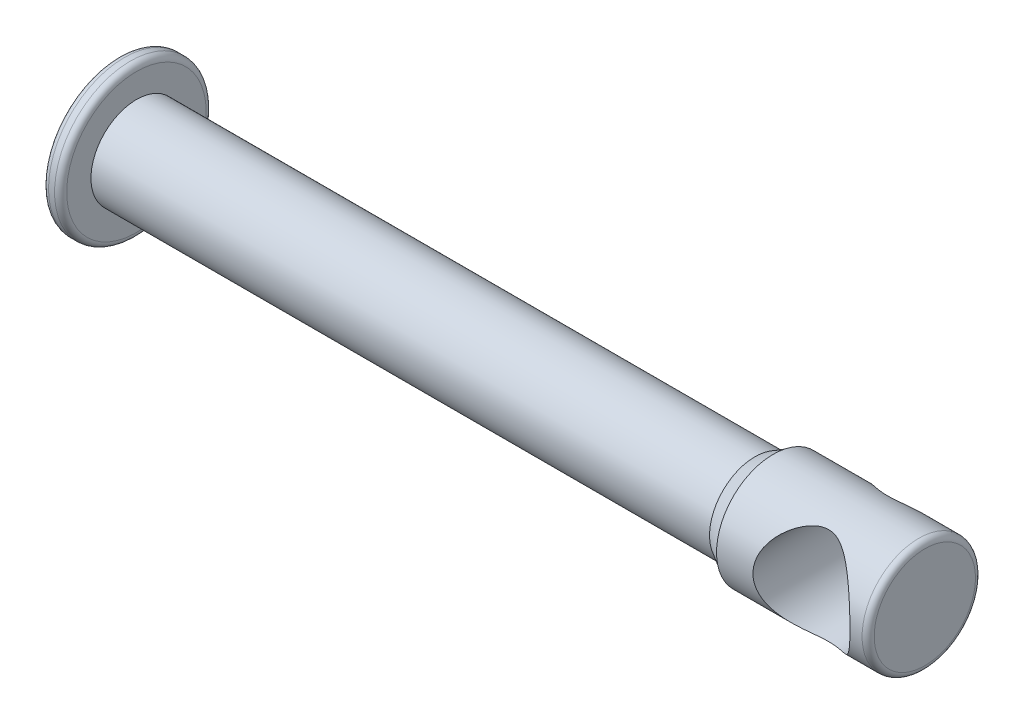
ISO-10303-21;
HEADER;
FILE_DESCRIPTION(('STEP AP214'),'2;1');
FILE_NAME('part.step','',(''),(''),'','','');
FILE_SCHEMA(('AUTOMOTIVE_DESIGN { 1 0 10303 214 1 1 1 1 }'));
ENDSEC;
DATA;
#1=APPLICATION_CONTEXT('core data for automotive mechanical design processes');
#2=APPLICATION_PROTOCOL_DEFINITION('international standard','automotive_design',2000,#1);
#3=PRODUCT_CONTEXT('',#1,'mechanical');
#4=PRODUCT('Part','Part','',(#3));
#5=PRODUCT_RELATED_PRODUCT_CATEGORY('part','',(#4));
#6=PRODUCT_DEFINITION_FORMATION('','',#4);
#7=PRODUCT_DEFINITION_CONTEXT('part definition',#1,'design');
#8=PRODUCT_DEFINITION('design','',#6,#7);
#9=PRODUCT_DEFINITION_SHAPE('','',#8);
#10=(LENGTH_UNIT() NAMED_UNIT(*) SI_UNIT(.MILLI.,.METRE.));
#11=(NAMED_UNIT(*) PLANE_ANGLE_UNIT() SI_UNIT($,.RADIAN.));
#12=(NAMED_UNIT(*) SI_UNIT($,.STERADIAN.) SOLID_ANGLE_UNIT());
#13=UNCERTAINTY_MEASURE_WITH_UNIT(LENGTH_MEASURE(1.E-05),#10,'distance_accuracy_value','');
#14=(GEOMETRIC_REPRESENTATION_CONTEXT(3) GLOBAL_UNCERTAINTY_ASSIGNED_CONTEXT((#13)) GLOBAL_UNIT_ASSIGNED_CONTEXT((#10,
#11,#12)) REPRESENTATION_CONTEXT('',''));
#15=CARTESIAN_POINT('',(0.,0.,0.));
#16=DIRECTION('',(0.,0.,1.));
#17=DIRECTION('',(1.,0.,0.));
#18=AXIS2_PLACEMENT_3D('',#15,#16,#17);
#19=CARTESIAN_POINT('',(0.,0.,0.));
#20=DIRECTION('',(-1.,0.,0.));
#21=DIRECTION('',(0.,0.,1.));
#22=AXIS2_PLACEMENT_3D('',#19,#20,#21);
#23=PLANE('',#22);
#24=CARTESIAN_POINT('',(0.,0.,0.));
#25=DIRECTION('',(-1.,0.,0.));
#26=DIRECTION('',(0.,0.,1.));
#27=AXIS2_PLACEMENT_3D('',#24,#25,#26);
#28=CIRCLE('',#27,11.5);
#29=CARTESIAN_POINT('',(0.,0.,11.5));
#30=VERTEX_POINT('',#29);
#31=EDGE_CURVE('E50',#30,#30,#28,.T.);
#32=ORIENTED_EDGE('',*,*,#31,.T.);
#33=EDGE_LOOP('',(#32));
#34=FACE_BOUND('',#33,.T.);
#35=ADVANCED_FACE('F37',(#34),#23,.T.);
#36=CARTESIAN_POINT('',(133.,0.,0.));
#37=DIRECTION('',(1.,0.,0.));
#38=DIRECTION('',(0.,0.,-1.));
#39=AXIS2_PLACEMENT_3D('',#36,#37,#38);
#40=CYLINDRICAL_SURFACE('',#39,12.5);
#41=CARTESIAN_POINT('',(2.,0.,0.));
#42=DIRECTION('',(1.,0.,0.));
#43=DIRECTION('',(0.,0.,-1.));
#44=AXIS2_PLACEMENT_3D('',#41,#42,#43);
#45=CIRCLE('',#44,12.5);
#46=CARTESIAN_POINT('',(2.,0.,-12.5));
#47=VERTEX_POINT('',#46);
#48=EDGE_CURVE('E55',#47,#47,#45,.F.);
#49=ORIENTED_EDGE('',*,*,#48,.T.);
#50=EDGE_LOOP('',(#49));
#51=FACE_BOUND('',#50,.T.);
#52=CARTESIAN_POINT('',(1.,0.,0.));
#53=DIRECTION('',(-1.,0.,0.));
#54=DIRECTION('',(0.,0.,1.));
#55=AXIS2_PLACEMENT_3D('',#52,#53,#54);
#56=CIRCLE('',#55,12.5);
#57=CARTESIAN_POINT('',(1.,0.,12.5));
#58=VERTEX_POINT('',#57);
#59=EDGE_CURVE('E61',#58,#58,#56,.F.);
#60=ORIENTED_EDGE('',*,*,#59,.T.);
#61=EDGE_LOOP('',(#60));
#62=FACE_BOUND('',#61,.T.);
#63=ADVANCED_FACE('F106',(#51,#62),#40,.T.);
#64=CARTESIAN_POINT('',(3.,0.,-12.5));
#65=DIRECTION('',(1.,0.,0.));
#66=DIRECTION('',(0.,0.,-1.));
#67=AXIS2_PLACEMENT_3D('',#64,#65,#66);
#68=PLANE('',#67);
#69=CARTESIAN_POINT('',(3.,0.,0.));
#70=DIRECTION('',(1.,0.,0.));
#71=DIRECTION('',(0.,0.,-1.));
#72=AXIS2_PLACEMENT_3D('',#69,#70,#71);
#73=CIRCLE('',#72,11.5);
#74=CARTESIAN_POINT('',(3.,0.,-11.5));
#75=VERTEX_POINT('',#74);
#76=EDGE_CURVE('E65',#75,#75,#73,.T.);
#77=ORIENTED_EDGE('',*,*,#76,.T.);
#78=EDGE_LOOP('',(#77));
#79=FACE_BOUND('',#78,.T.);
#80=CARTESIAN_POINT('',(3.,0.,0.));
#81=DIRECTION('',(1.,0.,0.));
#82=DIRECTION('',(0.,0.,-1.));
#83=AXIS2_PLACEMENT_3D('',#80,#81,#82);
#84=CIRCLE('',#83,7.49999999999998);
#85=CARTESIAN_POINT('',(3.,0.,-7.49999999999998));
#86=VERTEX_POINT('',#85);
#87=EDGE_CURVE('E210',#86,#86,#84,.T.);
#88=ORIENTED_EDGE('',*,*,#87,.F.);
#89=EDGE_LOOP('',(#88));
#90=FACE_BOUND('',#89,.T.);
#91=ADVANCED_FACE('F112',(#79,#90),#68,.T.);
#92=CARTESIAN_POINT('',(133.,0.,0.));
#93=DIRECTION('',(1.,0.,0.));
#94=DIRECTION('',(0.,0.,-1.));
#95=AXIS2_PLACEMENT_3D('',#92,#93,#94);
#96=CYLINDRICAL_SURFACE('',#95,7.49999999999998);
#97=CARTESIAN_POINT('',(105.,0.,0.));
#98=DIRECTION('',(-1.,0.,0.));
#99=DIRECTION('',(0.,0.,1.));
#100=AXIS2_PLACEMENT_3D('',#97,#98,#99);
#101=CIRCLE('',#100,7.49999999999998);
#102=CARTESIAN_POINT('',(105.,0.,-7.49999999999998));
#103=VERTEX_POINT('',#102);
#104=EDGE_CURVE('E69',#103,#103,#101,.T.);
#105=ORIENTED_EDGE('',*,*,#104,.T.);
#106=EDGE_LOOP('',(#105));
#107=FACE_BOUND('',#106,.T.);
#108=ORIENTED_EDGE('',*,*,#87,.T.);
#109=EDGE_LOOP('',(#108));
#110=FACE_BOUND('',#109,.T.);
#111=ADVANCED_FACE('F166',(#107,#110),#96,.T.);
#112=CARTESIAN_POINT('',(108.,0.,-7.49999999999998));
#113=DIRECTION('',(-1.,0.,0.));
#114=DIRECTION('',(0.,0.,1.));
#115=AXIS2_PLACEMENT_3D('',#112,#113,#114);
#116=PLANE('',#115);
#117=CARTESIAN_POINT('',(108.,0.,0.));
#118=DIRECTION('',(-1.,0.,0.));
#119=DIRECTION('',(0.,0.,1.));
#120=AXIS2_PLACEMENT_3D('',#117,#118,#119);
#121=CIRCLE('',#120,9.23205080756886);
#122=CARTESIAN_POINT('',(108.,0.,-9.23205080756886));
#123=VERTEX_POINT('',#122);
#124=EDGE_CURVE('E213',#123,#123,#121,.F.);
#125=ORIENTED_EDGE('',*,*,#124,.T.);
#126=EDGE_LOOP('',(#125));
#127=FACE_BOUND('',#126,.T.);
#128=CARTESIAN_POINT('',(108.,0.,0.));
#129=DIRECTION('',(1.,0.,0.));
#130=DIRECTION('',(0.,0.,-1.));
#131=AXIS2_PLACEMENT_3D('',#128,#129,#130);
#132=CIRCLE('',#131,9.35);
#133=CARTESIAN_POINT('',(108.,0.,-9.35));
#134=VERTEX_POINT('',#133);
#135=EDGE_CURVE('E79',#134,#134,#132,.T.);
#136=ORIENTED_EDGE('',*,*,#135,.F.);
#137=EDGE_LOOP('',(#136));
#138=FACE_BOUND('',#137,.T.);
#139=ADVANCED_FACE('F104',(#127,#138),#116,.T.);
#140=CARTESIAN_POINT('',(133.,0.,0.));
#141=DIRECTION('',(1.,0.,0.));
#142=DIRECTION('',(0.,0.,-1.));
#143=AXIS2_PLACEMENT_3D('',#140,#141,#142);
#144=CYLINDRICAL_SURFACE('',#143,9.35);
#145=CARTESIAN_POINT('',(132.,0.,0.));
#146=DIRECTION('',(1.,0.,0.));
#147=DIRECTION('',(0.,0.,-1.));
#148=AXIS2_PLACEMENT_3D('',#145,#146,#147);
#149=CIRCLE('',#148,9.35);
#150=CARTESIAN_POINT('',(132.,0.,-9.35));
#151=VERTEX_POINT('',#150);
#152=EDGE_CURVE('E10',#151,#151,#149,.F.);
#153=ORIENTED_EDGE('',*,*,#152,.T.);
#154=EDGE_LOOP('',(#153));
#155=FACE_BOUND('',#154,.T.);
#156=CARTESIAN_POINT('',(114.,0.,-9.35));
#157=CARTESIAN_POINT('',(113.999993918719,0.188513810223147,-9.3500059874259));
#158=CARTESIAN_POINT('',(114.00667046917,0.376974489429372,-9.34429094709547));
#159=CARTESIAN_POINT('',(114.033233959912,0.752339175981538,-9.32157765394355));
#160=CARTESIAN_POINT('',(114.05312367289,0.939242848263982,-9.30457703292499));
#161=CARTESIAN_POINT('',(114.105762021047,1.31000094157737,-9.25966015805698));
#162=CARTESIAN_POINT('',(114.138518632541,1.49385339730529,-9.23173713335002));
#163=CARTESIAN_POINT('',(114.216322164976,1.85711564710278,-9.16557262843749));
#164=CARTESIAN_POINT('',(114.26137438946,2.03652348754017,-9.12732669566652));
#165=CARTESIAN_POINT('',(114.362690090872,2.38847463003709,-9.04158612447));
#166=CARTESIAN_POINT('',(114.418875841079,2.56105609273721,-8.9941556557971));
#167=CARTESIAN_POINT('',(114.541877746082,2.89981081140834,-8.89072434564867));
#168=CARTESIAN_POINT('',(114.608698547206,3.06598122686232,-8.83471975865107));
#169=CARTESIAN_POINT('',(114.752123158968,3.39114343366845,-8.71508198169362));
#170=CARTESIAN_POINT('',(114.828725294421,3.55013644795042,-8.65145009812462));
#171=CARTESIAN_POINT('',(114.990936860748,3.86053279387089,-8.51747477777205));
#172=CARTESIAN_POINT('',(115.076548244839,4.01193446914854,-8.44712988590837));
#173=CARTESIAN_POINT('',(115.290034780286,4.36268261325394,-8.27290795245535));
#174=CARTESIAN_POINT('',(115.421638480642,4.55847596789633,-8.16641973997555));
#175=CARTESIAN_POINT('',(115.698885861276,4.93463241656784,-7.9447842256729));
#176=CARTESIAN_POINT('',(115.84453446207,5.11499006074713,-7.82963389227694));
#177=CARTESIAN_POINT('',(116.148881528328,5.46054494875063,-7.5926895214726));
#178=CARTESIAN_POINT('',(116.307610543521,5.62570467922296,-7.47088016841857));
#179=CARTESIAN_POINT('',(116.636834307734,5.94039666702075,-7.22317644140277));
#180=CARTESIAN_POINT('',(116.807327510767,6.08993097128641,-7.09728260534951));
#181=CARTESIAN_POINT('',(117.163112378899,6.37634133474767,-6.8412276787752));
#182=CARTESIAN_POINT('',(117.348633073184,6.51290146454229,-6.71103172535076));
#183=CARTESIAN_POINT('',(117.731332282924,6.76990629462221,-6.45168144636417));
#184=CARTESIAN_POINT('',(117.928514613244,6.89034567882049,-6.32252747754347));
#185=CARTESIAN_POINT('',(118.334429297125,7.11458071247304,-6.06908408115841));
#186=CARTESIAN_POINT('',(118.543136132289,7.2184112956292,-5.94478487033219));
#187=CARTESIAN_POINT('',(118.973141419016,7.40900622326599,-5.70547936538002));
#188=CARTESIAN_POINT('',(119.194429473289,7.49578440318619,-5.59046558255256));
#189=CARTESIAN_POINT('',(119.664053294902,7.65561840503674,-5.36969163303126));
#190=CARTESIAN_POINT('',(119.913213883027,7.72757785411689,-5.26486321178531));
#191=CARTESIAN_POINT('',(120.427004235485,7.84823667911879,-5.08327676560877));
#192=CARTESIAN_POINT('',(120.691600486729,7.89698448517863,-5.00646037389569));
#193=CARTESIAN_POINT('',(121.09947476795,7.9503663837464,-4.92090533334301));
#194=CARTESIAN_POINT('',(121.23839734088,7.96490447861482,-4.89726663702384));
#195=CARTESIAN_POINT('',(121.51832260278,7.98671784356547,-4.86161369428948));
#196=CARTESIAN_POINT('',(121.659325050066,7.99399395086199,-4.84959810788331));
#197=CARTESIAN_POINT('',(121.941923420117,8.00103644104855,-4.83797138882524));
#198=CARTESIAN_POINT('',(122.083518768671,8.00080891102131,-4.83835020161652));
#199=CARTESIAN_POINT('',(122.365893230366,7.99287824530194,-4.8514367488844));
#200=CARTESIAN_POINT('',(122.50667235376,7.98517520371398,-4.86414432816245));
#201=CARTESIAN_POINT('',(122.883136156933,7.9546423355252,-4.91402066207366));
#202=CARTESIAN_POINT('',(123.116886742888,7.92502483579293,-4.96204465470038));
#203=CARTESIAN_POINT('',(123.574138151935,7.8470513119542,-5.08442803409946));
#204=CARTESIAN_POINT('',(123.797620622882,7.79866309290107,-5.15883264912417));
#205=CARTESIAN_POINT('',(124.21421301832,7.6902221256267,-5.31897763851641));
#206=CARTESIAN_POINT('',(124.408282690884,7.63152895290613,-5.40319459569824));
#207=CARTESIAN_POINT('',(124.78710613566,7.50147917509817,-5.58234431039338));
#208=CARTESIAN_POINT('',(124.97185248183,7.43011267391632,-5.67728542073057));
#209=CARTESIAN_POINT('',(125.332866386434,7.27534618323157,-5.87431533186504));
#210=CARTESIAN_POINT('',(125.509112353692,7.19191750240908,-5.97642086732422));
#211=CARTESIAN_POINT('',(125.853120306214,7.01362825517287,-6.18468392389052));
#212=CARTESIAN_POINT('',(126.020884381938,6.91877052527046,-6.29084043515819));
#213=CARTESIAN_POINT('',(126.361347480941,6.70981792198647,-6.51352264879509));
#214=CARTESIAN_POINT('',(126.533375644447,6.59479267260591,-6.63020090363827));
#215=CARTESIAN_POINT('',(126.868103790493,6.35171977033739,-6.86342038839288));
#216=CARTESIAN_POINT('',(127.030802770722,6.22367072228143,-6.97996160226829));
#217=CARTESIAN_POINT('',(127.346472074182,5.95467755887812,-7.21080416883432));
#218=CARTESIAN_POINT('',(127.499452967291,5.81374787477331,-7.32510785815859));
#219=CARTESIAN_POINT('',(127.795364772157,5.51881989402648,-7.54980080598687));
#220=CARTESIAN_POINT('',(127.93829658941,5.36482277762185,-7.66019041673235));
#221=CARTESIAN_POINT('',(128.205340734566,5.05305722812581,-7.86906911854634));
#222=CARTESIAN_POINT('',(128.33006389762,4.89602681354827,-7.96787703708925));
#223=CARTESIAN_POINT('',(128.569003420858,4.5704436119471,-8.15899301526737));
#224=CARTESIAN_POINT('',(128.683221344318,4.40189254583074,-8.25130204151651));
#225=CARTESIAN_POINT('',(128.900028420293,4.05359832512615,-8.42786682720609));
#226=CARTESIAN_POINT('',(129.002624237967,3.87386167793718,-8.51212719807688));
#227=CARTESIAN_POINT('',(129.195008388784,3.50361945083793,-8.67108473112603));
#228=CARTESIAN_POINT('',(129.284799278458,3.31311603117303,-8.74578380193347));
#229=CARTESIAN_POINT('',(129.435792000122,2.95629869728257,-8.8719840307586));
#230=CARTESIAN_POINT('',(129.499248527065,2.79156367588052,-8.92525868129585));
#231=CARTESIAN_POINT('',(129.61574006533,2.45601861097929,-9.02335909692565));
#232=CARTESIAN_POINT('',(129.668777224735,2.28520982825632,-9.06818660342547));
#233=CARTESIAN_POINT('',(129.763674415134,1.93846586983604,-9.14857939987983));
#234=CARTESIAN_POINT('',(129.805539952684,1.76253326730736,-9.18414925277081));
#235=CARTESIAN_POINT('',(129.877471714336,1.40655888220269,-9.24536118424049));
#236=CARTESIAN_POINT('',(129.90753781963,1.22651705827061,-9.27100316285626));
#237=CARTESIAN_POINT('',(129.955461407552,0.862802488494996,-9.31191222938579));
#238=CARTESIAN_POINT('',(129.973263176877,0.679117022692341,-9.3271319702509));
#239=CARTESIAN_POINT('',(129.996110993323,0.310372043512817,-9.34667083977858));
#240=CARTESIAN_POINT('',(130.00115700847,0.125312526692874,-9.35098994111725));
#241=CARTESIAN_POINT('',(129.998398034662,-0.244637385347727,-9.34862934854359));
#242=CARTESIAN_POINT('',(129.990593152332,-0.429527781958835,-9.3419497458871));
#243=CARTESIAN_POINT('',(129.9622792694,-0.797607702038064,-9.31774313754608));
#244=CARTESIAN_POINT('',(129.941770743861,-0.980797288849415,-9.30021653749425));
#245=CARTESIAN_POINT('',(129.89032164973,-1.33113241490854,-9.25632269793747));
#246=CARTESIAN_POINT('',(129.860225349019,-1.49849346639056,-9.23067167316348));
#247=CARTESIAN_POINT('',(129.7898276699,-1.82954507160451,-9.17079999339578));
#248=CARTESIAN_POINT('',(129.749522871977,-1.99323437538066,-9.13657646693447));
#249=CARTESIAN_POINT('',(129.659267956831,-2.31596104876747,-9.06014946945538));
#250=CARTESIAN_POINT('',(129.609320857915,-2.47499985622003,-9.01794849568431));
#251=CARTESIAN_POINT('',(129.500376362847,-2.78779882156676,-8.92621351058679));
#252=CARTESIAN_POINT('',(129.441375602268,-2.94155699102346,-8.8766767734609));
#253=CARTESIAN_POINT('',(129.241218059103,-3.41907285208478,-8.70930829911634));
#254=CARTESIAN_POINT('',(129.084437631288,-3.73215875673097,-8.57915459692827));
#255=CARTESIAN_POINT('',(128.737476135474,-4.3272891370146,-8.29494686476888));
#256=CARTESIAN_POINT('',(128.547268309599,-4.6093084480982,-8.1408736994166));
#257=CARTESIAN_POINT('',(128.189305205167,-5.07504112977172,-7.85629298781015));
#258=CARTESIAN_POINT('',(128.027684730929,-5.26578645829913,-7.72942058802192));
#259=CARTESIAN_POINT('',(127.689947824636,-5.62903282874358,-7.46903040888049));
#260=CARTESIAN_POINT('',(127.513830743067,-5.8015330524041,-7.33551233187654));
#261=CARTESIAN_POINT('',(127.147758297712,-6.12870246412964,-7.06446963817114));
#262=CARTESIAN_POINT('',(126.957773758988,-6.28333218182558,-6.92693696250705));
#263=CARTESIAN_POINT('',(126.564800540589,-6.57437285115149,-6.65133322745438));
#264=CARTESIAN_POINT('',(126.361816242492,-6.71078989405414,-6.51326236404483));
#265=CARTESIAN_POINT('',(125.993219252827,-6.93460831177381,-6.27325866301849));
#266=CARTESIAN_POINT('',(125.830400223075,-7.02589626337335,-6.17064123170197));
#267=CARTESIAN_POINT('',(125.496815829468,-7.19774268470619,-5.96929678623815));
#268=CARTESIAN_POINT('',(125.326049487145,-7.27829982852675,-5.87057025391469));
#269=CARTESIAN_POINT('',(124.976528573932,-7.42807668220256,-5.67986220749344));
#270=CARTESIAN_POINT('',(124.797794191978,-7.49732317962703,-5.5878650501162));
#271=CARTESIAN_POINT('',(124.431624299205,-7.62395924668601,-5.41380836058901));
#272=CARTESIAN_POINT('',(124.244194040126,-7.68135586159467,-5.33174293567017));
#273=CARTESIAN_POINT('',(123.813404445372,-7.79566429466802,-5.16360532030302));
#274=CARTESIAN_POINT('',(123.567503328326,-7.84908412108896,-5.08138637338764));
#275=CARTESIAN_POINT('',(123.189753948305,-7.91206537450781,-4.98229487701192));
#276=CARTESIAN_POINT('',(123.062446626532,-7.93019434915,-4.95331567482182));
#277=CARTESIAN_POINT('',(122.8053925406,-7.96040591866441,-4.90461631689962));
#278=CARTESIAN_POINT('',(122.675647104995,-7.97249171276361,-4.88489126241412));
#279=CARTESIAN_POINT('',(122.413221444304,-7.99041425830268,-4.8555211065101));
#280=CARTESIAN_POINT('',(122.280524766227,-7.99618562134312,-4.84598150339942));
#281=CARTESIAN_POINT('',(122.014674443897,-8.00109094145662,-4.83787839963837));
#282=CARTESIAN_POINT('',(121.881520823634,-8.00022524181992,-4.83931433129802));
#283=CARTESIAN_POINT('',(121.615880664486,-7.99187889593087,-4.85308502300661));
#284=CARTESIAN_POINT('',(121.483394801198,-7.98439253618697,-4.86542919663367));
#285=CARTESIAN_POINT('',(121.220308637776,-7.96300898349501,-4.90034700315412));
#286=CARTESIAN_POINT('',(121.089708657548,-7.9491107157572,-4.92292235102681));
#287=CARTESIAN_POINT('',(120.805554185222,-7.91187132646552,-4.98259571693395));
#288=CARTESIAN_POINT('',(120.652594592769,-7.8872026839202,-5.02168801013107));
#289=CARTESIAN_POINT('',(120.351365132835,-7.82978630024434,-5.11074789007624));
#290=CARTESIAN_POINT('',(120.203099292462,-7.79703182288508,-5.16072454036484));
#291=CARTESIAN_POINT('',(119.911262136934,-7.72398016436033,-5.26943302739572));
#292=CARTESIAN_POINT('',(119.767705400691,-7.68366175887648,-5.32818940318451));
#293=CARTESIAN_POINT('',(119.485762138814,-7.5960774275886,-5.45232869226453));
#294=CARTESIAN_POINT('',(119.347374361356,-7.54881319779337,-5.51770998669799));
#295=CARTESIAN_POINT('',(118.984866420446,-7.41400395682274,-5.69867211297762));
#296=CARTESIAN_POINT('',(118.765105265369,-7.32061331564022,-5.81865786060241));
#297=CARTESIAN_POINT('',(118.3382234054,-7.11669684211597,-6.06637791960047));
#298=CARTESIAN_POINT('',(118.131110716481,-7.00616029743413,-6.19411704451511));
#299=CARTESIAN_POINT('',(117.728635070743,-6.76831832769321,-6.45316482495694));
#300=CARTESIAN_POINT('',(117.533288186678,-6.64099068942538,-6.58447802280273));
#301=CARTESIAN_POINT('',(117.154482994272,-6.36986610135016,-6.84711181499555));
#302=CARTESIAN_POINT('',(116.971021996737,-6.22607289741123,-6.978432400894));
#303=CARTESIAN_POINT('',(116.608052283262,-5.91494938112153,-7.24428404581306));
#304=CARTESIAN_POINT('',(116.429113208626,-5.74684080994613,-7.37868506856331));
#305=CARTESIAN_POINT('',(116.085346432365,-5.39238549431527,-7.64155585334965));
#306=CARTESIAN_POINT('',(115.92052153935,-5.20603513562723,-7.77002443254408));
#307=CARTESIAN_POINT('',(115.606842391728,-4.81560893442725,-8.01783959024303));
#308=CARTESIAN_POINT('',(115.457950640981,-4.61157684876816,-8.13720738656467));
#309=CARTESIAN_POINT('',(115.177671040887,-4.18577458466471,-8.36420491123982));
#310=CARTESIAN_POINT('',(115.046273815787,-3.96401401018148,-8.47184092129464));
#311=CARTESIAN_POINT('',(114.841414927247,-3.57583458577562,-8.64092789682562));
#312=CARTESIAN_POINT('',(114.762704348244,-3.41386078184576,-8.70627927945622));
#313=CARTESIAN_POINT('',(114.61547158541,-3.08246594798388,-8.82904903307521));
#314=CARTESIAN_POINT('',(114.546946746151,-2.91304687401413,-8.88646947138892));
#315=CARTESIAN_POINT('',(114.421023415796,-2.56765372337607,-8.99234259907161));
#316=CARTESIAN_POINT('',(114.36361045027,-2.39168853505673,-9.0408069509497));
#317=CARTESIAN_POINT('',(114.260653717282,-2.03400323046107,-9.12793687982023));
#318=CARTESIAN_POINT('',(114.215107527113,-1.85228429737183,-9.16660445686543));
#319=CARTESIAN_POINT('',(114.11807858243,-1.39714246375459,-9.24912116944221));
#320=CARTESIAN_POINT('',(114.073956708797,-1.12095379681478,-9.28678798017105));
#321=CARTESIAN_POINT('',(114.014920266794,-0.563137677037139,-9.33722436671735));
#322=CARTESIAN_POINT('',(114.000009081239,-0.281509598088423,-9.34999105891575));
#323=CARTESIAN_POINT('',(114.,0.,-9.35));
#324=B_SPLINE_CURVE_WITH_KNOTS('',3,(#156,#157,#158,#159,#160,#161,#162,#163,#164,#165,#166,
#167,#168,#169,#170,#171,#172,#173,#174,#175,#176,#177,#178,#179,#180,#181,#182,#183,#184,#185,
#186,#187,#188,#189,#190,#191,#192,#193,#194,#195,#196,#197,#198,#199,#200,#201,#202,#203,#204,
#205,#206,#207,#208,#209,#210,#211,#212,#213,#214,#215,#216,#217,#218,#219,#220,#221,#222,#223,
#224,#225,#226,#227,#228,#229,#230,#231,#232,#233,#234,#235,#236,#237,#238,#239,#240,#241,#242,
#243,#244,#245,#246,#247,#248,#249,#250,#251,#252,#253,#254,#255,#256,#257,#258,#259,#260,#261,
#262,#263,#264,#265,#266,#267,#268,#269,#270,#271,#272,#273,#274,#275,#276,#277,#278,#279,#280,
#281,#282,#283,#284,#285,#286,#287,#288,#289,#290,#291,#292,#293,#294,#295,#296,#297,#298,#299,
#300,#301,#302,#303,#304,#305,#306,#307,#308,#309,#310,#311,#312,#313,#314,#315,#316,#317,#318,
#319,#320,#321,#322,#323),.UNSPECIFIED.,.T.,.F.,(4,2,2,2,2,2,2,2,2,2,2,2,2,2,2,2,2,2,2,2,2,2,2,
2,2,2,2,2,2,2,2,2,2,2,2,2,2,2,2,2,2,2,2,2,2,2,2,2,2,2,2,2,2,2,2,2,2,2,2,2,2,2,2,2,2,2,2,2,2,2,2,
2,2,2,2,2,2,2,2,2,2,2,2,4),(0.,0.56524713954335,1.13061292960018,1.69632974983374,
2.26229097092971,2.82443204598389,3.38681939142793,3.94911054936011,4.51152386491381,
5.28689557710774,6.06253992821016,6.84005015867229,7.61745840679959,8.41053773298774,
9.20387794945113,9.99552692651146,10.786530924146,11.6236972231887,12.4591090711525,
12.8835295653103,13.30790112356,13.7319284326039,14.1559504039228,14.8742193860947,
15.5937258068017,16.2514069998196,16.909604026227,17.5693932265552,18.2290190135196,
18.9411722623007,19.6534018806576,20.3648430886341,21.0762201082086,21.746296641451,
22.4162732992594,23.0858637660126,23.7553203598,24.3079712655136,24.8605081154347,
25.4127721115953,25.9650416683119,26.5198037691863,27.074567260644,27.6293261492717,
28.1840642934712,28.6994073267632,29.214923212086,29.7302779876195,30.2458247397665,
31.3620842163382,32.4792413375485,33.319273669921,34.159343660105,35.0012350076769,
35.8428440735034,36.4814766818132,37.1201881273566,37.7573642310285,38.3941604076772,
39.1853605186678,39.5804086810827,39.9752474851359,40.3741373948275,40.7730066727886,
41.1722205028752,41.5715012751137,42.0501143530398,42.529127512385,43.0095054464324,
43.4897662776543,44.2902411176539,45.0912181041949,45.8932655499985,46.6951308934856,
47.5338679085551,48.3727714396489,49.2096551909638,50.0460886144059,50.6203046722801,
51.1943707680884,51.7676839715656,52.3408800362574,53.1848716278722,54.0289609541933),.UNSPECIFIED.);
#325=CARTESIAN_POINT('',(114.,0.,-9.35));
#326=VERTEX_POINT('',#325);
#327=EDGE_CURVE('E70',#326,#326,#324,.T.);
#328=ORIENTED_EDGE('',*,*,#327,.F.);
#329=EDGE_LOOP('',(#328));
#330=FACE_BOUND('',#329,.T.);
#331=CARTESIAN_POINT('',(130.,0.,9.35));
#332=CARTESIAN_POINT('',(130.000006081281,0.188513810223147,9.3500059874259));
#333=CARTESIAN_POINT('',(129.99332953083,0.376974489429371,9.34429094709547));
#334=CARTESIAN_POINT('',(129.966766040088,0.752339175981537,9.32157765394354));
#335=CARTESIAN_POINT('',(129.94687632711,0.939242848263979,9.30457703292498));
#336=CARTESIAN_POINT('',(129.894237978953,1.31000094157737,9.25966015805698));
#337=CARTESIAN_POINT('',(129.861481367459,1.49385339730529,9.23173713335002));
#338=CARTESIAN_POINT('',(129.783677835024,1.85711564710278,9.16557262843748));
#339=CARTESIAN_POINT('',(129.73862561054,2.03652348754016,9.12732669566652));
#340=CARTESIAN_POINT('',(129.637309909128,2.38847463003709,9.04158612446999));
#341=CARTESIAN_POINT('',(129.581124158921,2.56105609273722,8.9941556557971));
#342=CARTESIAN_POINT('',(129.458122253918,2.89981081140834,8.89072434564867));
#343=CARTESIAN_POINT('',(129.391301452794,3.06598122686232,8.83471975865107));
#344=CARTESIAN_POINT('',(129.247876841032,3.39114343366844,8.71508198169362));
#345=CARTESIAN_POINT('',(129.171274705579,3.55013644795042,8.65145009812462));
#346=CARTESIAN_POINT('',(129.009063139252,3.86053279387088,8.51747477777205));
#347=CARTESIAN_POINT('',(128.923451755161,4.01193446914854,8.44712988590837));
#348=CARTESIAN_POINT('',(128.709965219714,4.36268261325395,8.27290795245534));
#349=CARTESIAN_POINT('',(128.578361519358,4.55847596789634,8.16641973997554));
#350=CARTESIAN_POINT('',(128.301114138724,4.93463241656783,7.9447842256729));
#351=CARTESIAN_POINT('',(128.15546553793,5.11499006074713,7.82963389227694));
#352=CARTESIAN_POINT('',(127.851118471672,5.46054494875062,7.5926895214726));
#353=CARTESIAN_POINT('',(127.692389456479,5.62570467922295,7.47088016841857));
#354=CARTESIAN_POINT('',(127.363165692266,5.94039666702075,7.22317644140277));
#355=CARTESIAN_POINT('',(127.192672489233,6.08993097128641,7.09728260534951));
#356=CARTESIAN_POINT('',(126.836887621101,6.37634133474766,6.84122767877521));
#357=CARTESIAN_POINT('',(126.651366926816,6.51290146454228,6.71103172535077));
#358=CARTESIAN_POINT('',(126.268667717076,6.7699062946222,6.45168144636417));
#359=CARTESIAN_POINT('',(126.071485386756,6.89034567882048,6.32252747754347));
#360=CARTESIAN_POINT('',(125.665570702875,7.11458071247304,6.06908408115841));
#361=CARTESIAN_POINT('',(125.456863867711,7.21841129562919,5.94478487033219));
#362=CARTESIAN_POINT('',(125.026858580984,7.40900622326599,5.70547936538002));
#363=CARTESIAN_POINT('',(124.805570526711,7.49578440318619,5.59046558255255));
#364=CARTESIAN_POINT('',(124.335946705098,7.65561840503674,5.36969163303125));
#365=CARTESIAN_POINT('',(124.086786116973,7.72757785411689,5.26486321178531));
#366=CARTESIAN_POINT('',(123.572995764515,7.84823667911879,5.08327676560876));
#367=CARTESIAN_POINT('',(123.308399513271,7.89698448517863,5.00646037389569));
#368=CARTESIAN_POINT('',(122.90052523205,7.9503663837464,4.920905333343));
#369=CARTESIAN_POINT('',(122.76160265912,7.96490447861482,4.89726663702384));
#370=CARTESIAN_POINT('',(122.48167739722,7.98671784356547,4.86161369428948));
#371=CARTESIAN_POINT('',(122.340674949934,7.99399395086199,4.84959810788331));
#372=CARTESIAN_POINT('',(122.058076579883,8.00103644104854,4.83797138882524));
#373=CARTESIAN_POINT('',(121.916481231329,8.00080891102131,4.83835020161652));
#374=CARTESIAN_POINT('',(121.634106769634,7.99287824530194,4.85143674888439));
#375=CARTESIAN_POINT('',(121.49332764624,7.98517520371398,4.86414432816245));
#376=CARTESIAN_POINT('',(121.116863843067,7.9546423355252,4.91402066207366));
#377=CARTESIAN_POINT('',(120.883113257112,7.92502483579293,4.96204465470037));
#378=CARTESIAN_POINT('',(120.425861848065,7.8470513119542,5.08442803409946));
#379=CARTESIAN_POINT('',(120.202379377118,7.79866309290107,5.15883264912417));
#380=CARTESIAN_POINT('',(119.78578698168,7.6902221256267,5.31897763851641));
#381=CARTESIAN_POINT('',(119.591717309117,7.63152895290613,5.40319459569824));
#382=CARTESIAN_POINT('',(119.21289386434,7.50147917509817,5.58234431039337));
#383=CARTESIAN_POINT('',(119.02814751817,7.43011267391632,5.67728542073057));
#384=CARTESIAN_POINT('',(118.667133613566,7.27534618323157,5.87431533186503));
#385=CARTESIAN_POINT('',(118.490887646308,7.19191750240908,5.97642086732421));
#386=CARTESIAN_POINT('',(118.146879693786,7.01362825517288,6.18468392389051));
#387=CARTESIAN_POINT('',(117.979115618062,6.91877052527047,6.29084043515818));
#388=CARTESIAN_POINT('',(117.638652519059,6.70981792198647,6.51352264879507));
#389=CARTESIAN_POINT('',(117.466624355553,6.59479267260591,6.63020090363827));
#390=CARTESIAN_POINT('',(117.131896209507,6.35171977033739,6.86342038839287));
#391=CARTESIAN_POINT('',(116.969197229278,6.22367072228144,6.97996160226827));
#392=CARTESIAN_POINT('',(116.653527925818,5.95467755887814,7.21080416883431));
#393=CARTESIAN_POINT('',(116.500547032709,5.81374787477332,7.32510785815858));
#394=CARTESIAN_POINT('',(116.204635227843,5.51881989402648,7.54980080598686));
#395=CARTESIAN_POINT('',(116.06170341059,5.36482277762185,7.66019041673234));
#396=CARTESIAN_POINT('',(115.794659265434,5.05305722812581,7.86906911854634));
#397=CARTESIAN_POINT('',(115.66993610238,4.89602681354827,7.96787703708925));
#398=CARTESIAN_POINT('',(115.430996579142,4.5704436119471,8.15899301526736));
#399=CARTESIAN_POINT('',(115.316778655682,4.40189254583074,8.25130204151651));
#400=CARTESIAN_POINT('',(115.099971579707,4.05359832512614,8.4278668272061));
#401=CARTESIAN_POINT('',(114.997375762033,3.87386167793717,8.51212719807688));
#402=CARTESIAN_POINT('',(114.804991611216,3.50361945083792,8.67108473112603));
#403=CARTESIAN_POINT('',(114.715200721542,3.31311603117302,8.74578380193347));
#404=CARTESIAN_POINT('',(114.564207999878,2.95629869728256,8.8719840307586));
#405=CARTESIAN_POINT('',(114.500751472935,2.79156367588051,8.92525868129585));
#406=CARTESIAN_POINT('',(114.38425993467,2.45601861097927,9.02335909692565));
#407=CARTESIAN_POINT('',(114.331222775265,2.2852098282563,9.06818660342548));
#408=CARTESIAN_POINT('',(114.236325584866,1.93846586983601,9.14857939987984));
#409=CARTESIAN_POINT('',(114.194460047316,1.76253326730733,9.18414925277081));
#410=CARTESIAN_POINT('',(114.122528285664,1.40655888220265,9.2453611842405));
#411=CARTESIAN_POINT('',(114.09246218037,1.22651705827058,9.27100316285626));
#412=CARTESIAN_POINT('',(114.044538592448,0.862802488494957,9.31191222938579));
#413=CARTESIAN_POINT('',(114.026736823123,0.679117022692301,9.3271319702509));
#414=CARTESIAN_POINT('',(114.003889006677,0.310372043512775,9.34667083977858));
#415=CARTESIAN_POINT('',(113.99884299153,0.12531252669283,9.35098994111725));
#416=CARTESIAN_POINT('',(114.001601965338,-0.244637385347772,9.34862934854358));
#417=CARTESIAN_POINT('',(114.009406847668,-0.429527781958881,9.3419497458871));
#418=CARTESIAN_POINT('',(114.037720730601,-0.797607702038111,9.31774313754607));
#419=CARTESIAN_POINT('',(114.058229256139,-0.980797288849462,9.30021653749424));
#420=CARTESIAN_POINT('',(114.10967835027,-1.33113241490859,9.25632269793746));
#421=CARTESIAN_POINT('',(114.139774650982,-1.49849346639061,9.23067167316347));
#422=CARTESIAN_POINT('',(114.2101723301,-1.82954507160457,9.17079999339576));
#423=CARTESIAN_POINT('',(114.250477128023,-1.99323437538071,9.13657646693445));
#424=CARTESIAN_POINT('',(114.340732043169,-2.31596104876752,9.06014946945536));
#425=CARTESIAN_POINT('',(114.390679142085,-2.47499985622008,9.01794849568429));
#426=CARTESIAN_POINT('',(114.499623637153,-2.78779882156681,8.92621351058678));
#427=CARTESIAN_POINT('',(114.558624397732,-2.9415569910235,8.87667677346088));
#428=CARTESIAN_POINT('',(114.758781940897,-3.41907285208482,8.70930829911633));
#429=CARTESIAN_POINT('',(114.915562368712,-3.732158756731,8.57915459692824));
#430=CARTESIAN_POINT('',(115.262523864526,-4.32728913701463,8.29494686476886));
#431=CARTESIAN_POINT('',(115.452731690401,-4.60930844809824,8.14087369941658));
#432=CARTESIAN_POINT('',(115.810694794833,-5.07504112977175,7.85629298781013));
#433=CARTESIAN_POINT('',(115.972315269071,-5.26578645829917,7.72942058802189));
#434=CARTESIAN_POINT('',(116.310052175364,-5.62903282874361,7.46903040888046));
#435=CARTESIAN_POINT('',(116.486169256933,-5.80153305240413,7.33551233187651));
#436=CARTESIAN_POINT('',(116.852241702288,-6.12870246412967,7.06446963817111));
#437=CARTESIAN_POINT('',(117.042226241012,-6.2833321818256,6.92693696250702));
#438=CARTESIAN_POINT('',(117.435199459411,-6.57437285115151,6.65133322745436));
#439=CARTESIAN_POINT('',(117.638183757508,-6.71078989405416,6.5132623640448));
#440=CARTESIAN_POINT('',(118.006780747173,-6.93460831177383,6.27325866301846));
#441=CARTESIAN_POINT('',(118.169599776925,-7.02589626337337,6.17064123170194));
#442=CARTESIAN_POINT('',(118.503184170532,-7.19774268470621,5.96929678623812));
#443=CARTESIAN_POINT('',(118.673950512855,-7.27829982852677,5.87057025391467));
#444=CARTESIAN_POINT('',(119.023471426068,-7.42807668220258,5.67986220749341));
#445=CARTESIAN_POINT('',(119.202205808022,-7.49732317962704,5.58786505011617));
#446=CARTESIAN_POINT('',(119.568375700795,-7.62395924668602,5.41380836058899));
#447=CARTESIAN_POINT('',(119.755805959874,-7.68135586159467,5.33174293567015));
#448=CARTESIAN_POINT('',(120.186595554628,-7.79566429466802,5.16360532030301));
#449=CARTESIAN_POINT('',(120.432496671674,-7.84908412108896,5.08138637338763));
#450=CARTESIAN_POINT('',(120.810246051695,-7.91206537450781,4.98229487701191));
#451=CARTESIAN_POINT('',(120.937553373468,-7.93019434915001,4.95331567482181));
#452=CARTESIAN_POINT('',(121.1946074594,-7.96040591866442,4.90461631689961));
#453=CARTESIAN_POINT('',(121.324352895005,-7.97249171276361,4.88489126241411));
#454=CARTESIAN_POINT('',(121.586778555696,-7.99041425830268,4.8555211065101));
#455=CARTESIAN_POINT('',(121.719475233773,-7.99618562134312,4.84598150339942));
#456=CARTESIAN_POINT('',(121.985325556103,-8.00109094145662,4.83787839963837));
#457=CARTESIAN_POINT('',(122.118479176366,-8.00022524181992,4.83931433129801));
#458=CARTESIAN_POINT('',(122.384119335514,-7.99187889593087,4.8530850230066));
#459=CARTESIAN_POINT('',(122.516605198802,-7.98439253618697,4.86542919663366));
#460=CARTESIAN_POINT('',(122.779691362224,-7.96300898349501,4.90034700315412));
#461=CARTESIAN_POINT('',(122.910291342452,-7.94911071575719,4.92292235102681));
#462=CARTESIAN_POINT('',(123.194445814778,-7.91187132646551,4.98259571693395));
#463=CARTESIAN_POINT('',(123.347405407231,-7.8872026839202,5.02168801013107));
#464=CARTESIAN_POINT('',(123.648634867165,-7.82978630024434,5.11074789007624));
#465=CARTESIAN_POINT('',(123.796900707538,-7.79703182288508,5.16072454036484));
#466=CARTESIAN_POINT('',(124.088737863066,-7.72398016436032,5.26943302739573));
#467=CARTESIAN_POINT('',(124.232294599309,-7.68366175887647,5.32818940318452));
#468=CARTESIAN_POINT('',(124.514237861186,-7.59607742758859,5.45232869226454));
#469=CARTESIAN_POINT('',(124.652625638644,-7.54881319779336,5.517709986698));
#470=CARTESIAN_POINT('',(125.015133579554,-7.41400395682273,5.69867211297763));
#471=CARTESIAN_POINT('',(125.234894734631,-7.32061331564021,5.81865786060241));
#472=CARTESIAN_POINT('',(125.6617765946,-7.11669684211595,6.06637791960049));
#473=CARTESIAN_POINT('',(125.868889283519,-7.0061602974341,6.19411704451514));
#474=CARTESIAN_POINT('',(126.271364929257,-6.76831832769317,6.45316482495697));
#475=CARTESIAN_POINT('',(126.466711813322,-6.64099068942534,6.58447802280277));
#476=CARTESIAN_POINT('',(126.845517005728,-6.36986610135011,6.84711181499559));
#477=CARTESIAN_POINT('',(127.028978003263,-6.22607289741118,6.97843240089404));
#478=CARTESIAN_POINT('',(127.391947716738,-5.91494938112149,7.24428404581309));
#479=CARTESIAN_POINT('',(127.570886791374,-5.74684080994609,7.37868506856334));
#480=CARTESIAN_POINT('',(127.914653567635,-5.39238549431522,7.64155585334968));
#481=CARTESIAN_POINT('',(128.07947846065,-5.20603513562718,7.77002443254412));
#482=CARTESIAN_POINT('',(128.393157608272,-4.81560893442719,8.01783959024307));
#483=CARTESIAN_POINT('',(128.542049359019,-4.61157684876809,8.1372073865647));
#484=CARTESIAN_POINT('',(128.822328959113,-4.18577458466463,8.36420491123985));
#485=CARTESIAN_POINT('',(128.953726184213,-3.96401401018139,8.47184092129468));
#486=CARTESIAN_POINT('',(129.158585072753,-3.57583458577552,8.64092789682565));
#487=CARTESIAN_POINT('',(129.237295651756,-3.41386078184567,8.70627927945625));
#488=CARTESIAN_POINT('',(129.38452841459,-3.08246594798379,8.82904903307524));
#489=CARTESIAN_POINT('',(129.453053253849,-2.91304687401404,8.88646947138894));
#490=CARTESIAN_POINT('',(129.578976584204,-2.56765372337599,8.99234259907163));
#491=CARTESIAN_POINT('',(129.63638954973,-2.39168853505665,9.04080695094972));
#492=CARTESIAN_POINT('',(129.739346282718,-2.03400323046099,9.12793687982024));
#493=CARTESIAN_POINT('',(129.784892472887,-1.85228429737174,9.16660445686545));
#494=CARTESIAN_POINT('',(129.88192141757,-1.39714246375451,9.24912116944222));
#495=CARTESIAN_POINT('',(129.926043291203,-1.12095379681472,9.28678798017105));
#496=CARTESIAN_POINT('',(129.985079733206,-0.56313767703711,9.33722436671735));
#497=CARTESIAN_POINT('',(129.999990918761,-0.281509598088408,9.34999105891575));
#498=CARTESIAN_POINT('',(130.,0.,9.35));
#499=B_SPLINE_CURVE_WITH_KNOTS('',3,(#331,#332,#333,#334,#335,#336,#337,#338,#339,#340,#341,
#342,#343,#344,#345,#346,#347,#348,#349,#350,#351,#352,#353,#354,#355,#356,#357,#358,#359,#360,
#361,#362,#363,#364,#365,#366,#367,#368,#369,#370,#371,#372,#373,#374,#375,#376,#377,#378,#379,
#380,#381,#382,#383,#384,#385,#386,#387,#388,#389,#390,#391,#392,#393,#394,#395,#396,#397,#398,
#399,#400,#401,#402,#403,#404,#405,#406,#407,#408,#409,#410,#411,#412,#413,#414,#415,#416,#417,
#418,#419,#420,#421,#422,#423,#424,#425,#426,#427,#428,#429,#430,#431,#432,#433,#434,#435,#436,
#437,#438,#439,#440,#441,#442,#443,#444,#445,#446,#447,#448,#449,#450,#451,#452,#453,#454,#455,
#456,#457,#458,#459,#460,#461,#462,#463,#464,#465,#466,#467,#468,#469,#470,#471,#472,#473,#474,
#475,#476,#477,#478,#479,#480,#481,#482,#483,#484,#485,#486,#487,#488,#489,#490,#491,#492,#493,
#494,#495,#496,#497,#498),.UNSPECIFIED.,.T.,.F.,(4,2,2,2,2,2,2,2,2,2,2,2,2,2,2,2,2,2,2,2,2,2,2,
2,2,2,2,2,2,2,2,2,2,2,2,2,2,2,2,2,2,2,2,2,2,2,2,2,2,2,2,2,2,2,2,2,2,2,2,2,2,2,2,2,2,2,2,2,2,2,2,
2,2,2,2,2,2,2,2,2,2,2,2,4),(0.,0.56524713954335,1.13061292960018,1.69632974983374,
2.26229097092971,2.8244320459839,3.38681939142792,3.9491105493601,4.51152386491381,
5.28689557710776,6.06253992821014,6.84005015867229,7.61745840679958,8.41053773298771,
9.2038779494511,9.99552692651145,10.786530924146,11.6236972231887,12.4591090711525,
12.8835295653103,13.30790112356,13.7319284326039,14.1559504039228,14.8742193860947,
15.5937258068017,16.2514069998196,16.909604026227,17.5693932265552,18.2290190135196,
18.9411722623007,19.6534018806576,20.3648430886341,21.0762201082087,21.746296641451,
22.4162732992594,23.0858637660126,23.7553203598,24.3079712655136,24.8605081154347,
25.4127721115953,25.9650416683119,26.5198037691863,27.074567260644,27.6293261492717,
28.1840642934713,28.6994073267633,29.214923212086,29.7302779876195,30.2458247397666,
31.3620842163382,32.4792413375485,33.319273669921,34.1593436601051,35.0012350076769,
35.8428440735035,36.4814766818132,37.1201881273566,37.7573642310286,38.3941604076772,
39.1853605186679,39.5804086810827,39.975247485136,40.3741373948275,40.7730066727886,
41.1722205028752,41.5715012751137,42.0501143530398,42.529127512385,43.0095054464324,
43.4897662776543,44.2902411176539,45.0912181041949,45.8932655499986,46.6951308934857,
47.5338679085552,48.372771439649,49.209655190964,50.046088614406,50.6203046722802,
51.1943707680885,51.7676839715657,52.3408800362575,53.1848716278723,54.0289609541933),.UNSPECIFIED.);
#500=CARTESIAN_POINT('',(130.,0.,9.35));
#501=VERTEX_POINT('',#500);
#502=EDGE_CURVE('E80',#501,#501,#499,.T.);
#503=ORIENTED_EDGE('',*,*,#502,.F.);
#504=EDGE_LOOP('',(#503));
#505=FACE_BOUND('',#504,.T.);
#506=ORIENTED_EDGE('',*,*,#135,.T.);
#507=EDGE_LOOP('',(#506));
#508=FACE_BOUND('',#507,.T.);
#509=ADVANCED_FACE('F85',(#155,#330,#505,#508),#144,.T.);
#510=CARTESIAN_POINT('',(133.,0.,-9.35));
#511=DIRECTION('',(1.,0.,0.));
#512=DIRECTION('',(0.,0.,-1.));
#513=AXIS2_PLACEMENT_3D('',#510,#511,#512);
#514=PLANE('',#513);
#515=CARTESIAN_POINT('',(133.,0.,0.));
#516=DIRECTION('',(1.,0.,0.));
#517=DIRECTION('',(0.,0.,-1.));
#518=AXIS2_PLACEMENT_3D('',#515,#516,#517);
#519=CIRCLE('',#518,8.35);
#520=CARTESIAN_POINT('',(133.,0.,-8.35));
#521=VERTEX_POINT('',#520);
#522=EDGE_CURVE('E45',#521,#521,#519,.T.);
#523=ORIENTED_EDGE('',*,*,#522,.T.);
#524=EDGE_LOOP('',(#523));
#525=FACE_BOUND('',#524,.T.);
#526=ADVANCED_FACE('F95',(#525),#514,.T.);
#527=CARTESIAN_POINT('',(108.,0.,0.));
#528=DIRECTION('',(1.,0.,0.));
#529=DIRECTION('',(0.,0.,-1.));
#530=AXIS2_PLACEMENT_3D('',#527,#528,#529);
#531=CONICAL_SURFACE('',#530,9.23205080756886,0.523598775598304);
#532=CARTESIAN_POINT('',(105.,0.,-7.49999999999998));
#533=CARTESIAN_POINT('',(105.03125,0.,-7.51804219591216));
#534=CARTESIAN_POINT('',(105.0625,0.,-7.53608439182433));
#535=CARTESIAN_POINT('',(105.125,0.,-7.57216878364869));
#536=CARTESIAN_POINT('',(105.15625,0.,-7.59021097956086));
#537=CARTESIAN_POINT('',(105.21875,0.,-7.62629537138521));
#538=CARTESIAN_POINT('',(105.25,0.,-7.64433756729739));
#539=CARTESIAN_POINT('',(105.3125,0.,-7.68042195912174));
#540=CARTESIAN_POINT('',(105.34375,0.,-7.69846415503392));
#541=CARTESIAN_POINT('',(105.40625,0.,-7.73454854685827));
#542=CARTESIAN_POINT('',(105.4375,0.,-7.75259074277044));
#543=CARTESIAN_POINT('',(105.5,0.,-7.78867513459479));
#544=CARTESIAN_POINT('',(105.53125,0.,-7.80671733050697));
#545=CARTESIAN_POINT('',(105.59375,0.,-7.84280172233132));
#546=CARTESIAN_POINT('',(105.625,0.,-7.8608439182435));
#547=CARTESIAN_POINT('',(105.6875,0.,-7.89692831006785));
#548=CARTESIAN_POINT('',(105.71875,0.,-7.91497050598003));
#549=CARTESIAN_POINT('',(105.78125,0.,-7.95105489780437));
#550=CARTESIAN_POINT('',(105.8125,0.,-7.96909709371655));
#551=CARTESIAN_POINT('',(105.875,0.,-8.0051814855409));
#552=CARTESIAN_POINT('',(105.90625,0.,-8.02322368145308));
#553=CARTESIAN_POINT('',(105.96875,0.,-8.05930807327743));
#554=CARTESIAN_POINT('',(106.,0.,-8.07735026918961));
#555=CARTESIAN_POINT('',(106.0625,0.,-8.11343466101396));
#556=CARTESIAN_POINT('',(106.09375,0.,-8.13147685692613));
#557=CARTESIAN_POINT('',(106.15625,0.,-8.16756124875049));
#558=CARTESIAN_POINT('',(106.1875,0.,-8.18560344466266));
#559=CARTESIAN_POINT('',(106.25,0.,-8.22168783648702));
#560=CARTESIAN_POINT('',(106.28125,0.,-8.23973003239919));
#561=CARTESIAN_POINT('',(106.34375,0.,-8.27581442422354));
#562=CARTESIAN_POINT('',(106.375,0.,-8.29385662013572));
#563=CARTESIAN_POINT('',(106.4375,0.,-8.32994101196007));
#564=CARTESIAN_POINT('',(106.46875,0.,-8.34798320787224));
#565=CARTESIAN_POINT('',(106.53125,0.,-8.3840675996966));
#566=CARTESIAN_POINT('',(106.5625,0.,-8.40210979560877));
#567=CARTESIAN_POINT('',(106.625,0.,-8.43819418743313));
#568=CARTESIAN_POINT('',(106.65625,0.,-8.4562363833453));
#569=CARTESIAN_POINT('',(106.71875,0.,-8.49232077516965));
#570=CARTESIAN_POINT('',(106.75,0.,-8.51036297108183));
#571=CARTESIAN_POINT('',(106.8125,0.,-8.54644736290618));
#572=CARTESIAN_POINT('',(106.84375,0.,-8.56448955881836));
#573=CARTESIAN_POINT('',(106.90625,0.,-8.60057395064271));
#574=CARTESIAN_POINT('',(106.9375,0.,-8.61861614655488));
#575=CARTESIAN_POINT('',(107.,0.,-8.65470053837923));
#576=CARTESIAN_POINT('',(107.03125,0.,-8.67274273429141));
#577=CARTESIAN_POINT('',(107.09375,0.,-8.70882712611576));
#578=CARTESIAN_POINT('',(107.125,0.,-8.72686932202794));
#579=CARTESIAN_POINT('',(107.1875,0.,-8.76295371385229));
#580=CARTESIAN_POINT('',(107.21875,0.,-8.78099590976447));
#581=CARTESIAN_POINT('',(107.28125,0.,-8.81708030158882));
#582=CARTESIAN_POINT('',(107.3125,0.,-8.83512249750099));
#583=CARTESIAN_POINT('',(107.375,0.,-8.87120688932534));
#584=CARTESIAN_POINT('',(107.40625,0.,-8.88924908523752));
#585=CARTESIAN_POINT('',(107.46875,0.,-8.92533347706187));
#586=CARTESIAN_POINT('',(107.5,0.,-8.94337567297405));
#587=CARTESIAN_POINT('',(107.5625,0.,-8.9794600647984));
#588=CARTESIAN_POINT('',(107.59375,0.,-8.99750226071058));
#589=CARTESIAN_POINT('',(107.65625,0.,-9.03358665253493));
#590=CARTESIAN_POINT('',(107.6875,0.,-9.05162884844711));
#591=CARTESIAN_POINT('',(107.75,0.,-9.08771324027146));
#592=CARTESIAN_POINT('',(107.78125,0.,-9.10575543618363));
#593=CARTESIAN_POINT('',(107.84375,0.,-9.14183982800798));
#594=CARTESIAN_POINT('',(107.875,0.,-9.15988202392016));
#595=CARTESIAN_POINT('',(107.9375,0.,-9.19596641574451));
#596=CARTESIAN_POINT('',(107.96875,0.,-9.21400861165669));
#597=CARTESIAN_POINT('',(108.,0.,-9.23205080756886));
#598=B_SPLINE_CURVE_WITH_KNOTS('',3,(#532,#533,#534,#535,#536,#537,#538,#539,#540,#541,#542,
#543,#544,#545,#546,#547,#548,#549,#550,#551,#552,#553,#554,#555,#556,#557,#558,#559,#560,#561,
#562,#563,#564,#565,#566,#567,#568,#569,#570,#571,#572,#573,#574,#575,#576,#577,#578,#579,#580,
#581,#582,#583,#584,#585,#586,#587,#588,#589,#590,#591,#592,#593,#594,#595,#596,#597),
.UNSPECIFIED.,.F.,.F.,(4,2,2,2,2,2,2,2,2,2,2,2,2,2,2,2,2,2,2,2,2,2,2,2,2,2,2,2,2,2,2,2,4),(0.,
0.108253175473046,0.216506350946104,0.324759526419162,0.433012701892208,0.541265877365266,
0.649519052838323,0.757772228311369,0.866025403784427,0.974278579257486,1.08253175473053,
1.19078493020359,1.29903810567665,1.40729128114969,1.51554445662275,1.62379763209581,
1.73205080756887,1.84030398304191,1.94855715851497,2.05681033398803,2.16506350946107,
2.27331668493413,2.38156986040719,2.48982303588024,2.59807621135329,2.70632938682635,
2.8145825622994,2.92283573777246,3.03108891324551,3.13934208871856,3.24759526419162,
3.35584843966468,3.46410161513773),.UNSPECIFIED.);
#599=EDGE_CURVE('BSEAM93',#103,#123,#598,.T.);
#600=ORIENTED_EDGE('',*,*,#104,.F.);
#601=ORIENTED_EDGE('',*,*,#124,.F.);
#602=ORIENTED_EDGE('',*,*,#599,.T.);
#603=ORIENTED_EDGE('',*,*,#599,.F.);
#604=EDGE_LOOP('',(#600,#602,#601,#603));
#605=FACE_BOUND('',#604,.T.);
#606=ADVANCED_FACE('F93',(#605),#531,.T.);
#607=CARTESIAN_POINT('',(122.,0.,-12.5));
#608=DIRECTION('',(0.,0.,1.));
#609=DIRECTION('',(1.,0.,0.));
#610=AXIS2_PLACEMENT_3D('',#607,#608,#609);
#611=CYLINDRICAL_SURFACE('',#610,8.);
#612=ORIENTED_EDGE('',*,*,#327,.T.);
#613=EDGE_LOOP('',(#612));
#614=FACE_BOUND('',#613,.T.);
#615=ORIENTED_EDGE('',*,*,#502,.T.);
#616=EDGE_LOOP('',(#615));
#617=FACE_BOUND('',#616,.T.);
#618=ADVANCED_FACE('F89',(#614,#617),#611,.F.);
#619=CARTESIAN_POINT('',(2.,0.,0.));
#620=DIRECTION('',(1.,0.,0.));
#621=DIRECTION('',(0.,0.,-1.));
#622=AXIS2_PLACEMENT_3D('',#619,#620,#621);
#623=TOROIDAL_SURFACE('',#622,11.5,1.);
#624=ORIENTED_EDGE('',*,*,#48,.F.);
#625=EDGE_LOOP('',(#624));
#626=FACE_BOUND('',#625,.T.);
#627=ORIENTED_EDGE('',*,*,#76,.F.);
#628=EDGE_LOOP('',(#627));
#629=FACE_BOUND('',#628,.T.);
#630=ADVANCED_FACE('F92',(#626,#629),#623,.T.);
#631=CARTESIAN_POINT('',(1.,0.,0.));
#632=DIRECTION('',(-1.,0.,0.));
#633=DIRECTION('',(0.,0.,1.));
#634=AXIS2_PLACEMENT_3D('',#631,#632,#633);
#635=TOROIDAL_SURFACE('',#634,11.5,1.);
#636=ORIENTED_EDGE('',*,*,#31,.F.);
#637=EDGE_LOOP('',(#636));
#638=FACE_BOUND('',#637,.T.);
#639=ORIENTED_EDGE('',*,*,#59,.F.);
#640=EDGE_LOOP('',(#639));
#641=FACE_BOUND('',#640,.T.);
#642=ADVANCED_FACE('F118',(#638,#641),#635,.T.);
#643=CARTESIAN_POINT('',(132.,0.,0.));
#644=DIRECTION('',(1.,0.,0.));
#645=DIRECTION('',(0.,0.,-1.));
#646=AXIS2_PLACEMENT_3D('',#643,#644,#645);
#647=TOROIDAL_SURFACE('',#646,8.35,1.);
#648=ORIENTED_EDGE('',*,*,#152,.F.);
#649=EDGE_LOOP('',(#648));
#650=FACE_BOUND('',#649,.T.);
#651=ORIENTED_EDGE('',*,*,#522,.F.);
#652=EDGE_LOOP('',(#651));
#653=FACE_BOUND('',#652,.T.);
#654=ADVANCED_FACE('F39',(#650,#653),#647,.T.);
#655=CLOSED_SHELL('',(#35,#63,#91,#111,#139,#509,#526,#606,#618,#630,#642,#654));
#656=MANIFOLD_SOLID_BREP('B2',#655);
#657=ADVANCED_BREP_SHAPE_REPRESENTATION('',(#18,#656),#14);
#658=SHAPE_DEFINITION_REPRESENTATION(#9,#657);
ENDSEC;
END-ISO-10303-21;
